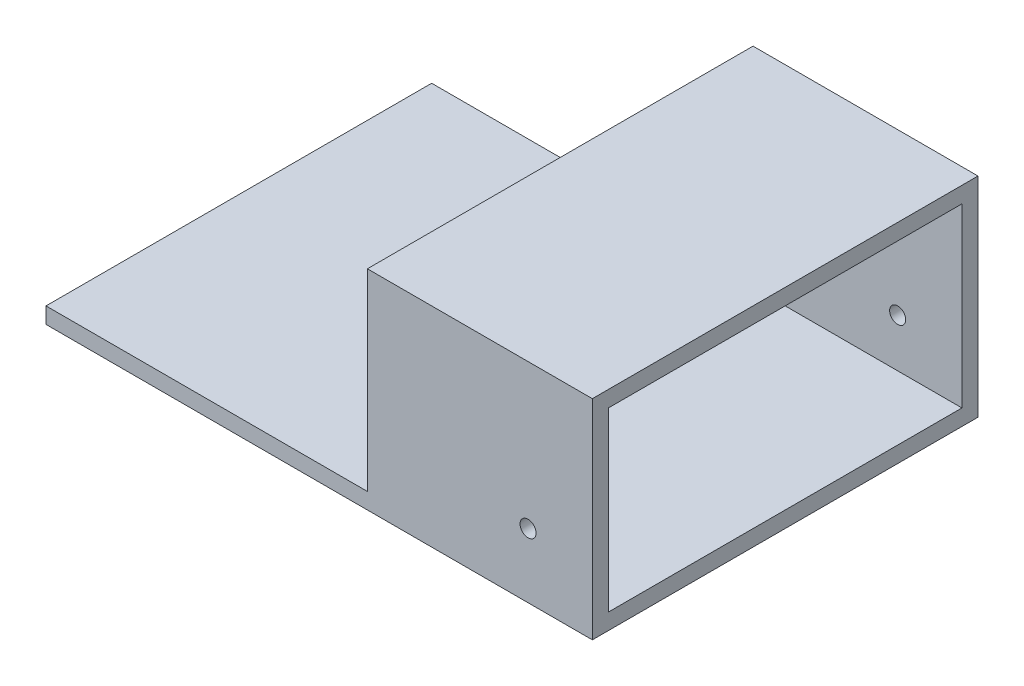
ISO-10303-21;
HEADER;
FILE_DESCRIPTION(('STEP AP214'),'2;1');
FILE_NAME('part.step','',(''),(''),'','','');
FILE_SCHEMA(('AUTOMOTIVE_DESIGN { 1 0 10303 214 1 1 1 1 }'));
ENDSEC;
DATA;
#1=APPLICATION_CONTEXT('core data for automotive mechanical design processes');
#2=APPLICATION_PROTOCOL_DEFINITION('international standard','automotive_design',2000,#1);
#3=PRODUCT_CONTEXT('',#1,'mechanical');
#4=PRODUCT('Part','Part','',(#3));
#5=PRODUCT_RELATED_PRODUCT_CATEGORY('part','',(#4));
#6=PRODUCT_DEFINITION_FORMATION('','',#4);
#7=PRODUCT_DEFINITION_CONTEXT('part definition',#1,'design');
#8=PRODUCT_DEFINITION('design','',#6,#7);
#9=PRODUCT_DEFINITION_SHAPE('','',#8);
#10=(LENGTH_UNIT() NAMED_UNIT(*) SI_UNIT(.MILLI.,.METRE.));
#11=(NAMED_UNIT(*) PLANE_ANGLE_UNIT() SI_UNIT($,.RADIAN.));
#12=(NAMED_UNIT(*) SI_UNIT($,.STERADIAN.) SOLID_ANGLE_UNIT());
#13=UNCERTAINTY_MEASURE_WITH_UNIT(LENGTH_MEASURE(1.E-05),#10,'distance_accuracy_value','');
#14=(GEOMETRIC_REPRESENTATION_CONTEXT(3) GLOBAL_UNCERTAINTY_ASSIGNED_CONTEXT((#13)) GLOBAL_UNIT_ASSIGNED_CONTEXT((#10,
#11,#12)) REPRESENTATION_CONTEXT('',''));
#15=CARTESIAN_POINT('',(0.,0.,0.));
#16=DIRECTION('',(0.,0.,1.));
#17=DIRECTION('',(1.,0.,0.));
#18=AXIS2_PLACEMENT_3D('',#15,#16,#17);
#19=CARTESIAN_POINT('',(-215.9,6.35,0.));
#20=DIRECTION('',(1.,0.,0.));
#21=DIRECTION('',(0.,0.,-1.));
#22=AXIS2_PLACEMENT_3D('',#19,#20,#21);
#23=PLANE('',#22);
#24=DIRECTION('',(0.,0.,1.));
#25=VECTOR('',#24,1.);
#26=CARTESIAN_POINT('',(-215.9,0.,0.));
#27=LINE('',#26,#25);
#28=CARTESIAN_POINT('',(-215.9,0.,-152.4));
#29=VERTEX_POINT('',#28);
#30=CARTESIAN_POINT('',(-215.9,0.,0.));
#31=VERTEX_POINT('',#30);
#32=EDGE_CURVE('E202',#29,#31,#27,.T.);
#33=ORIENTED_EDGE('',*,*,#32,.T.);
#34=DIRECTION('',(0.,-1.,0.));
#35=VECTOR('',#34,1.);
#36=CARTESIAN_POINT('',(-215.9,6.35,0.));
#37=LINE('',#36,#35);
#38=CARTESIAN_POINT('',(-215.9,6.35,0.));
#39=VERTEX_POINT('',#38);
#40=EDGE_CURVE('E11',#39,#31,#37,.T.);
#41=ORIENTED_EDGE('',*,*,#40,.F.);
#42=DIRECTION('',(0.,0.,1.));
#43=VECTOR('',#42,1.);
#44=CARTESIAN_POINT('',(-215.9,6.35,0.));
#45=LINE('',#44,#43);
#46=CARTESIAN_POINT('',(-215.9,6.35,-152.4));
#47=VERTEX_POINT('',#46);
#48=EDGE_CURVE('E203',#47,#39,#45,.T.);
#49=ORIENTED_EDGE('',*,*,#48,.F.);
#50=DIRECTION('',(0.,-1.,0.));
#51=VECTOR('',#50,1.);
#52=CARTESIAN_POINT('',(-215.9,6.35,-152.4));
#53=LINE('',#52,#51);
#54=EDGE_CURVE('E50',#47,#29,#53,.T.);
#55=ORIENTED_EDGE('',*,*,#54,.T.);
#56=EDGE_LOOP('',(#33,#41,#49,#55));
#57=FACE_BOUND('',#56,.T.);
#58=ADVANCED_FACE('F41',(#57),#23,.F.);
#59=CARTESIAN_POINT('',(0.,6.35,0.));
#60=DIRECTION('',(0.,0.,-1.));
#61=DIRECTION('',(-1.,0.,0.));
#62=AXIS2_PLACEMENT_3D('',#59,#60,#61);
#63=PLANE('',#62);
#64=CARTESIAN_POINT('',(-25.4,25.4,0.));
#65=DIRECTION('',(0.,0.,-1.));
#66=DIRECTION('',(-1.,0.,0.));
#67=AXIS2_PLACEMENT_3D('',#64,#65,#66);
#68=CIRCLE('',#67,3.17499999999996);
#69=CARTESIAN_POINT('',(-28.575,25.4,0.));
#70=VERTEX_POINT('',#69);
#71=EDGE_CURVE('E363',#70,#70,#68,.T.);
#72=ORIENTED_EDGE('',*,*,#71,.T.);
#73=EDGE_LOOP('',(#72));
#74=FACE_BOUND('',#73,.T.);
#75=DIRECTION('',(1.,0.,0.));
#76=VECTOR('',#75,1.);
#77=CARTESIAN_POINT('',(0.,0.,0.));
#78=LINE('',#77,#76);
#79=CARTESIAN_POINT('',(0.,0.,0.));
#80=VERTEX_POINT('',#79);
#81=EDGE_CURVE('E221',#31,#80,#78,.T.);
#82=ORIENTED_EDGE('',*,*,#81,.T.);
#83=DIRECTION('',(0.,-1.,0.));
#84=VECTOR('',#83,1.);
#85=CARTESIAN_POINT('',(0.,82.55,0.));
#86=LINE('',#85,#84);
#87=CARTESIAN_POINT('',(0.,82.55,0.));
#88=VERTEX_POINT('',#87);
#89=EDGE_CURVE('E194',#88,#80,#86,.T.);
#90=ORIENTED_EDGE('',*,*,#89,.F.);
#91=DIRECTION('',(-1.,0.,0.));
#92=VECTOR('',#91,1.);
#93=CARTESIAN_POINT('',(0.,82.55,0.));
#94=LINE('',#93,#92);
#95=CARTESIAN_POINT('',(-88.9,82.55,0.));
#96=VERTEX_POINT('',#95);
#97=EDGE_CURVE('E173',#88,#96,#94,.T.);
#98=ORIENTED_EDGE('',*,*,#97,.T.);
#99=DIRECTION('',(0.,-1.,0.));
#100=VECTOR('',#99,1.);
#101=CARTESIAN_POINT('',(-88.9,82.55,0.));
#102=LINE('',#101,#100);
#103=CARTESIAN_POINT('',(-88.9,6.34999999999999,0.));
#104=VERTEX_POINT('',#103);
#105=EDGE_CURVE('E198',#96,#104,#102,.T.);
#106=ORIENTED_EDGE('',*,*,#105,.T.);
#107=DIRECTION('',(1.,0.,0.));
#108=VECTOR('',#107,1.);
#109=CARTESIAN_POINT('',(0.,6.35,0.));
#110=LINE('',#109,#108);
#111=EDGE_CURVE('E206',#39,#104,#110,.T.);
#112=ORIENTED_EDGE('',*,*,#111,.F.);
#113=ORIENTED_EDGE('',*,*,#40,.T.);
#114=EDGE_LOOP('',(#82,#90,#98,#106,#112,#113));
#115=FACE_BOUND('',#114,.T.);
#116=ADVANCED_FACE('F239',(#74,#115),#63,.F.);
#117=CARTESIAN_POINT('',(0.,6.35,-152.4));
#118=DIRECTION('',(0.,0.,1.));
#119=DIRECTION('',(1.,0.,0.));
#120=AXIS2_PLACEMENT_3D('',#117,#118,#119);
#121=PLANE('',#120);
#122=CARTESIAN_POINT('',(-25.4,25.4,-152.4));
#123=DIRECTION('',(0.,0.,-1.));
#124=DIRECTION('',(-1.,0.,0.));
#125=AXIS2_PLACEMENT_3D('',#122,#123,#124);
#126=CIRCLE('',#125,3.17499999999998);
#127=CARTESIAN_POINT('',(-28.575,25.4,-152.4));
#128=VERTEX_POINT('',#127);
#129=EDGE_CURVE('E357',#128,#128,#126,.T.);
#130=ORIENTED_EDGE('',*,*,#129,.F.);
#131=EDGE_LOOP('',(#130));
#132=FACE_BOUND('',#131,.T.);
#133=DIRECTION('',(-1.,0.,0.));
#134=VECTOR('',#133,1.);
#135=CARTESIAN_POINT('',(0.,0.,-152.4));
#136=LINE('',#135,#134);
#137=CARTESIAN_POINT('',(0.,0.,-152.4));
#138=VERTEX_POINT('',#137);
#139=EDGE_CURVE('E207',#138,#29,#136,.T.);
#140=ORIENTED_EDGE('',*,*,#139,.T.);
#141=ORIENTED_EDGE('',*,*,#54,.F.);
#142=DIRECTION('',(-1.,0.,0.));
#143=VECTOR('',#142,1.);
#144=CARTESIAN_POINT('',(0.,6.35,-152.4));
#145=LINE('',#144,#143);
#146=CARTESIAN_POINT('',(-88.9,6.35,-152.4));
#147=VERTEX_POINT('',#146);
#148=EDGE_CURVE('E215',#147,#47,#145,.T.);
#149=ORIENTED_EDGE('',*,*,#148,.F.);
#150=DIRECTION('',(0.,-1.,0.));
#151=VECTOR('',#150,1.);
#152=CARTESIAN_POINT('',(-88.9,82.55,-152.4));
#153=LINE('',#152,#151);
#154=CARTESIAN_POINT('',(-88.9,82.55,-152.4));
#155=VERTEX_POINT('',#154);
#156=EDGE_CURVE('E183',#155,#147,#153,.T.);
#157=ORIENTED_EDGE('',*,*,#156,.F.);
#158=DIRECTION('',(-1.,0.,0.));
#159=VECTOR('',#158,1.);
#160=CARTESIAN_POINT('',(0.,82.55,-152.4));
#161=LINE('',#160,#159);
#162=CARTESIAN_POINT('',(0.,82.55,-152.4));
#163=VERTEX_POINT('',#162);
#164=EDGE_CURVE('E180',#163,#155,#161,.T.);
#165=ORIENTED_EDGE('',*,*,#164,.F.);
#166=DIRECTION('',(0.,-1.,0.));
#167=VECTOR('',#166,1.);
#168=CARTESIAN_POINT('',(0.,82.55,-152.4));
#169=LINE('',#168,#167);
#170=EDGE_CURVE('E190',#163,#138,#169,.T.);
#171=ORIENTED_EDGE('',*,*,#170,.T.);
#172=EDGE_LOOP('',(#140,#141,#149,#157,#165,#171));
#173=FACE_BOUND('',#172,.T.);
#174=ADVANCED_FACE('F241',(#132,#173),#121,.F.);
#175=CARTESIAN_POINT('',(0.,6.35,0.));
#176=DIRECTION('',(0.,1.,0.));
#177=DIRECTION('',(0.,0.,1.));
#178=AXIS2_PLACEMENT_3D('',#175,#176,#177);
#179=PLANE('',#178);
#180=ORIENTED_EDGE('',*,*,#48,.T.);
#181=ORIENTED_EDGE('',*,*,#111,.T.);
#182=DIRECTION('',(0.,0.,-1.));
#183=VECTOR('',#182,1.);
#184=CARTESIAN_POINT('',(-88.9,6.35,0.));
#185=LINE('',#184,#183);
#186=CARTESIAN_POINT('',(-88.9,6.35,-6.34999999999999));
#187=VERTEX_POINT('',#186);
#188=EDGE_CURVE('E212',#104,#187,#185,.T.);
#189=ORIENTED_EDGE('',*,*,#188,.T.);
#190=DIRECTION('',(-1.,0.,0.));
#191=VECTOR('',#190,1.);
#192=CARTESIAN_POINT('',(0.,6.35,-6.34999999999999));
#193=LINE('',#192,#191);
#194=CARTESIAN_POINT('',(0.,6.34999999999999,-6.34999999999999));
#195=VERTEX_POINT('',#194);
#196=EDGE_CURVE('E126',#195,#187,#193,.T.);
#197=ORIENTED_EDGE('',*,*,#196,.F.);
#198=DIRECTION('',(0.,0.,1.));
#199=VECTOR('',#198,1.);
#200=CARTESIAN_POINT('',(0.,6.35,-146.05));
#201=LINE('',#200,#199);
#202=CARTESIAN_POINT('',(0.,6.35,-146.05));
#203=VERTEX_POINT('',#202);
#204=EDGE_CURVE('E130',#203,#195,#201,.T.);
#205=ORIENTED_EDGE('',*,*,#204,.F.);
#206=DIRECTION('',(-1.,0.,0.));
#207=VECTOR('',#206,1.);
#208=CARTESIAN_POINT('',(0.,6.35,-146.05));
#209=LINE('',#208,#207);
#210=CARTESIAN_POINT('',(-88.9,6.35,-146.05));
#211=VERTEX_POINT('',#210);
#212=EDGE_CURVE('E117',#203,#211,#209,.T.);
#213=ORIENTED_EDGE('',*,*,#212,.T.);
#214=EDGE_CURVE('E211',#211,#147,#185,.T.);
#215=ORIENTED_EDGE('',*,*,#214,.T.);
#216=ORIENTED_EDGE('',*,*,#148,.T.);
#217=EDGE_LOOP('',(#180,#181,#189,#197,#205,#213,#215,#216));
#218=FACE_BOUND('',#217,.T.);
#219=ADVANCED_FACE('F132',(#218),#179,.T.);
#220=CARTESIAN_POINT('',(0.,0.,0.));
#221=DIRECTION('',(0.,1.,0.));
#222=DIRECTION('',(0.,0.,1.));
#223=AXIS2_PLACEMENT_3D('',#220,#221,#222);
#224=PLANE('',#223);
#225=ORIENTED_EDGE('',*,*,#32,.F.);
#226=ORIENTED_EDGE('',*,*,#139,.F.);
#227=DIRECTION('',(0.,0.,-1.));
#228=VECTOR('',#227,1.);
#229=CARTESIAN_POINT('',(0.,0.,0.));
#230=LINE('',#229,#228);
#231=EDGE_CURVE('E163',#80,#138,#230,.T.);
#232=ORIENTED_EDGE('',*,*,#231,.F.);
#233=ORIENTED_EDGE('',*,*,#81,.F.);
#234=EDGE_LOOP('',(#225,#226,#232,#233));
#235=FACE_BOUND('',#234,.T.);
#236=ADVANCED_FACE('F236',(#235),#224,.F.);
#237=CARTESIAN_POINT('',(-88.9,82.55,0.));
#238=DIRECTION('',(-1.,0.,0.));
#239=DIRECTION('',(0.,0.,1.));
#240=AXIS2_PLACEMENT_3D('',#237,#238,#239);
#241=PLANE('',#240);
#242=DIRECTION('',(0.,-1.,0.));
#243=VECTOR('',#242,1.);
#244=CARTESIAN_POINT('',(-88.9,76.2,-146.05));
#245=LINE('',#244,#243);
#246=CARTESIAN_POINT('',(-88.9,76.2,-146.05));
#247=VERTEX_POINT('',#246);
#248=EDGE_CURVE('E57',#247,#211,#245,.T.);
#249=ORIENTED_EDGE('',*,*,#248,.F.);
#250=DIRECTION('',(0.,0.,-1.));
#251=VECTOR('',#250,1.);
#252=CARTESIAN_POINT('',(-88.9,76.2,-146.05));
#253=LINE('',#252,#251);
#254=CARTESIAN_POINT('',(-88.9,76.2,-6.34999999999999));
#255=VERTEX_POINT('',#254);
#256=EDGE_CURVE('E141',#255,#247,#253,.T.);
#257=ORIENTED_EDGE('',*,*,#256,.F.);
#258=DIRECTION('',(0.,1.,0.));
#259=VECTOR('',#258,1.);
#260=CARTESIAN_POINT('',(-88.9,76.2,-6.34999999999999));
#261=LINE('',#260,#259);
#262=EDGE_CURVE('E145',#187,#255,#261,.T.);
#263=ORIENTED_EDGE('',*,*,#262,.F.);
#264=ORIENTED_EDGE('',*,*,#188,.F.);
#265=ORIENTED_EDGE('',*,*,#105,.F.);
#266=DIRECTION('',(0.,0.,-1.));
#267=VECTOR('',#266,1.);
#268=CARTESIAN_POINT('',(-88.9,82.55,0.));
#269=LINE('',#268,#267);
#270=EDGE_CURVE('E169',#96,#155,#269,.T.);
#271=ORIENTED_EDGE('',*,*,#270,.T.);
#272=ORIENTED_EDGE('',*,*,#156,.T.);
#273=ORIENTED_EDGE('',*,*,#214,.F.);
#274=EDGE_LOOP('',(#249,#257,#263,#264,#265,#271,#272,#273));
#275=FACE_BOUND('',#274,.T.);
#276=ADVANCED_FACE('F245',(#275),#241,.T.);
#277=CARTESIAN_POINT('',(0.,82.55,0.));
#278=DIRECTION('',(-1.,0.,0.));
#279=DIRECTION('',(0.,0.,1.));
#280=AXIS2_PLACEMENT_3D('',#277,#278,#279);
#281=PLANE('',#280);
#282=DIRECTION('',(0.,0.,-1.));
#283=VECTOR('',#282,1.);
#284=CARTESIAN_POINT('',(0.,76.2,-146.05));
#285=LINE('',#284,#283);
#286=CARTESIAN_POINT('',(0.,76.2,-6.34999999999999));
#287=VERTEX_POINT('',#286);
#288=CARTESIAN_POINT('',(0.,76.2,-146.05));
#289=VERTEX_POINT('',#288);
#290=EDGE_CURVE('E127',#287,#289,#285,.T.);
#291=ORIENTED_EDGE('',*,*,#290,.T.);
#292=DIRECTION('',(0.,-1.,0.));
#293=VECTOR('',#292,1.);
#294=CARTESIAN_POINT('',(0.,76.2,-146.05));
#295=LINE('',#294,#293);
#296=EDGE_CURVE('E121',#289,#203,#295,.T.);
#297=ORIENTED_EDGE('',*,*,#296,.T.);
#298=ORIENTED_EDGE('',*,*,#204,.T.);
#299=DIRECTION('',(0.,1.,0.));
#300=VECTOR('',#299,1.);
#301=CARTESIAN_POINT('',(0.,76.2,-6.34999999999999));
#302=LINE('',#301,#300);
#303=EDGE_CURVE('E65',#195,#287,#302,.T.);
#304=ORIENTED_EDGE('',*,*,#303,.T.);
#305=EDGE_LOOP('',(#291,#297,#298,#304));
#306=FACE_BOUND('',#305,.T.);
#307=ORIENTED_EDGE('',*,*,#231,.T.);
#308=ORIENTED_EDGE('',*,*,#170,.F.);
#309=DIRECTION('',(0.,0.,-1.));
#310=VECTOR('',#309,1.);
#311=CARTESIAN_POINT('',(0.,82.55,0.));
#312=LINE('',#311,#310);
#313=EDGE_CURVE('E177',#88,#163,#312,.T.);
#314=ORIENTED_EDGE('',*,*,#313,.F.);
#315=ORIENTED_EDGE('',*,*,#89,.T.);
#316=EDGE_LOOP('',(#307,#308,#314,#315));
#317=FACE_BOUND('',#316,.T.);
#318=ADVANCED_FACE('F137',(#306,#317),#281,.F.);
#319=CARTESIAN_POINT('',(0.,82.55,0.));
#320=DIRECTION('',(0.,1.,0.));
#321=DIRECTION('',(0.,0.,1.));
#322=AXIS2_PLACEMENT_3D('',#319,#320,#321);
#323=PLANE('',#322);
#324=ORIENTED_EDGE('',*,*,#270,.F.);
#325=ORIENTED_EDGE('',*,*,#97,.F.);
#326=ORIENTED_EDGE('',*,*,#313,.T.);
#327=ORIENTED_EDGE('',*,*,#164,.T.);
#328=EDGE_LOOP('',(#324,#325,#326,#327));
#329=FACE_BOUND('',#328,.T.);
#330=ADVANCED_FACE('F248',(#329),#323,.T.);
#331=CARTESIAN_POINT('',(0.,76.2,-146.05));
#332=DIRECTION('',(0.,0.,-1.));
#333=DIRECTION('',(-1.,0.,0.));
#334=AXIS2_PLACEMENT_3D('',#331,#332,#333);
#335=PLANE('',#334);
#336=CARTESIAN_POINT('',(-25.4,25.4,-146.05));
#337=DIRECTION('',(0.,0.,-1.));
#338=DIRECTION('',(-1.,0.,0.));
#339=AXIS2_PLACEMENT_3D('',#336,#337,#338);
#340=CIRCLE('',#339,3.17499999999997);
#341=CARTESIAN_POINT('',(-28.575,25.4,-146.05));
#342=VERTEX_POINT('',#341);
#343=EDGE_CURVE('E148',#342,#342,#340,.T.);
#344=ORIENTED_EDGE('',*,*,#343,.T.);
#345=EDGE_LOOP('',(#344));
#346=FACE_BOUND('',#345,.T.);
#347=ORIENTED_EDGE('',*,*,#248,.T.);
#348=ORIENTED_EDGE('',*,*,#212,.F.);
#349=ORIENTED_EDGE('',*,*,#296,.F.);
#350=DIRECTION('',(-1.,0.,0.));
#351=VECTOR('',#350,1.);
#352=CARTESIAN_POINT('',(0.,76.2,-146.05));
#353=LINE('',#352,#351);
#354=EDGE_CURVE('E160',#289,#247,#353,.T.);
#355=ORIENTED_EDGE('',*,*,#354,.T.);
#356=EDGE_LOOP('',(#347,#348,#349,#355));
#357=FACE_BOUND('',#356,.T.);
#358=ADVANCED_FACE('F119',(#346,#357),#335,.F.);
#359=CARTESIAN_POINT('',(0.,76.2,-146.05));
#360=DIRECTION('',(0.,1.,0.));
#361=DIRECTION('',(0.,0.,1.));
#362=AXIS2_PLACEMENT_3D('',#359,#360,#361);
#363=PLANE('',#362);
#364=ORIENTED_EDGE('',*,*,#256,.T.);
#365=ORIENTED_EDGE('',*,*,#354,.F.);
#366=ORIENTED_EDGE('',*,*,#290,.F.);
#367=DIRECTION('',(-1.,0.,0.));
#368=VECTOR('',#367,1.);
#369=CARTESIAN_POINT('',(0.,76.2,-6.34999999999999));
#370=LINE('',#369,#368);
#371=EDGE_CURVE('E164',#287,#255,#370,.T.);
#372=ORIENTED_EDGE('',*,*,#371,.T.);
#373=EDGE_LOOP('',(#364,#365,#366,#372));
#374=FACE_BOUND('',#373,.T.);
#375=ADVANCED_FACE('F297',(#374),#363,.F.);
#376=CARTESIAN_POINT('',(0.,76.2,-6.34999999999999));
#377=DIRECTION('',(0.,0.,1.));
#378=DIRECTION('',(1.,0.,0.));
#379=AXIS2_PLACEMENT_3D('',#376,#377,#378);
#380=PLANE('',#379);
#381=CARTESIAN_POINT('',(-25.4,25.4,-6.34999999999999));
#382=DIRECTION('',(0.,0.,1.));
#383=DIRECTION('',(1.,0.,0.));
#384=AXIS2_PLACEMENT_3D('',#381,#382,#383);
#385=CIRCLE('',#384,3.17499999999997);
#386=CARTESIAN_POINT('',(-22.2250000000001,25.4,-6.34999999999999));
#387=VERTEX_POINT('',#386);
#388=EDGE_CURVE('E44',#387,#387,#385,.T.);
#389=ORIENTED_EDGE('',*,*,#388,.T.);
#390=EDGE_LOOP('',(#389));
#391=FACE_BOUND('',#390,.T.);
#392=ORIENTED_EDGE('',*,*,#262,.T.);
#393=ORIENTED_EDGE('',*,*,#371,.F.);
#394=ORIENTED_EDGE('',*,*,#303,.F.);
#395=ORIENTED_EDGE('',*,*,#196,.T.);
#396=EDGE_LOOP('',(#392,#393,#394,#395));
#397=FACE_BOUND('',#396,.T.);
#398=ADVANCED_FACE('F301',(#391,#397),#380,.F.);
#399=CARTESIAN_POINT('',(-25.4,25.4,-152.4));
#400=DIRECTION('',(0.,0.,-1.));
#401=DIRECTION('',(-1.,0.,0.));
#402=AXIS2_PLACEMENT_3D('',#399,#400,#401);
#403=CYLINDRICAL_SURFACE('',#402,3.17499999999997);
#404=ORIENTED_EDGE('',*,*,#71,.F.);
#405=EDGE_LOOP('',(#404));
#406=FACE_BOUND('',#405,.T.);
#407=ORIENTED_EDGE('',*,*,#388,.F.);
#408=EDGE_LOOP('',(#407));
#409=FACE_BOUND('',#408,.T.);
#410=ADVANCED_FACE('F331',(#406,#409),#403,.F.);
#411=ORIENTED_EDGE('',*,*,#129,.T.);
#412=EDGE_LOOP('',(#411));
#413=FACE_BOUND('',#412,.T.);
#414=ORIENTED_EDGE('',*,*,#343,.F.);
#415=EDGE_LOOP('',(#414));
#416=FACE_BOUND('',#415,.T.);
#417=ADVANCED_FACE('F341',(#413,#416),#403,.F.);
#418=CLOSED_SHELL('',(#58,#116,#174,#219,#236,#276,#318,#330,#358,#375,#398,#410,#417));
#419=MANIFOLD_SOLID_BREP('B2',#418);
#420=ADVANCED_BREP_SHAPE_REPRESENTATION('',(#18,#419),#14);
#421=SHAPE_DEFINITION_REPRESENTATION(#9,#420);
ENDSEC;
END-ISO-10303-21;
